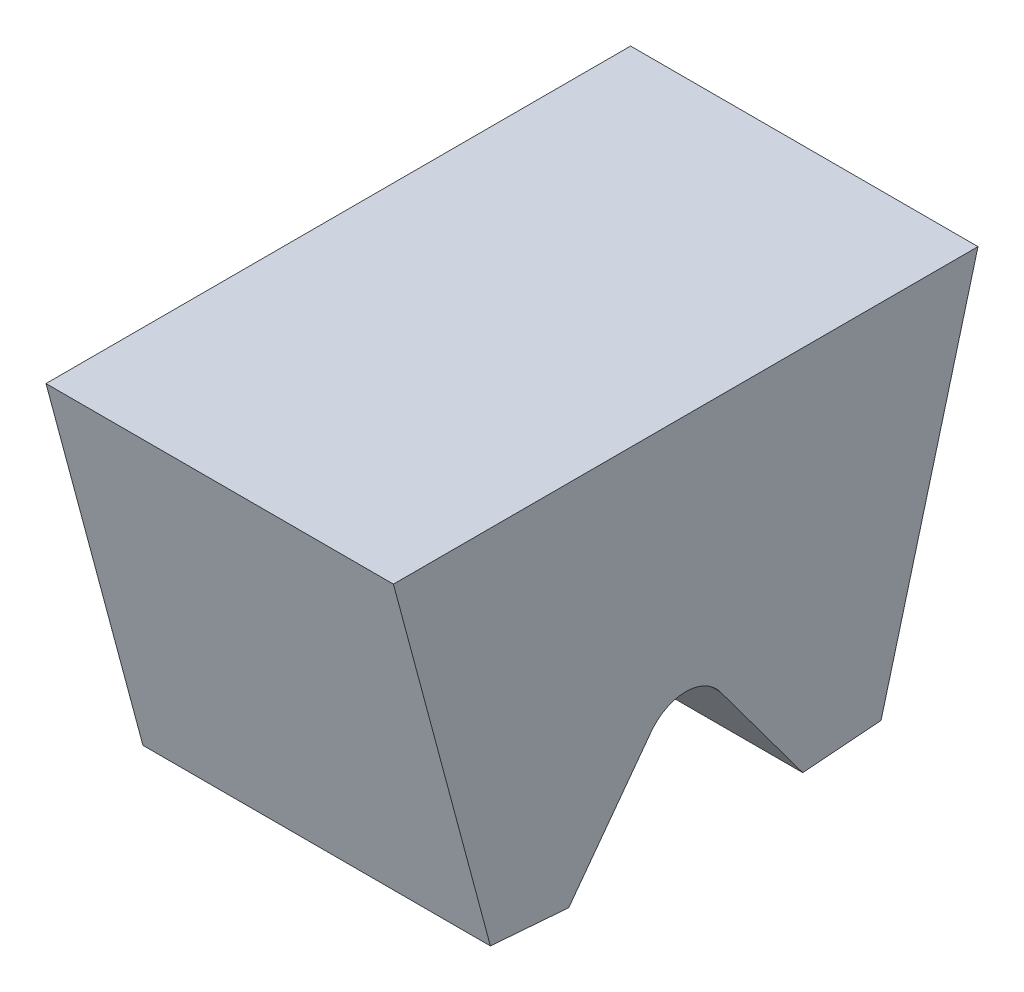
ISO-10303-21;
HEADER;
FILE_DESCRIPTION(('STEP AP214'),'2;1');
FILE_NAME('part.step','',(''),(''),'','','');
FILE_SCHEMA(('AUTOMOTIVE_DESIGN { 1 0 10303 214 1 1 1 1 }'));
ENDSEC;
DATA;
#1=APPLICATION_CONTEXT('core data for automotive mechanical design processes');
#2=APPLICATION_PROTOCOL_DEFINITION('international standard','automotive_design',2000,#1);
#3=PRODUCT_CONTEXT('',#1,'mechanical');
#4=PRODUCT('Part','Part','',(#3));
#5=PRODUCT_RELATED_PRODUCT_CATEGORY('part','',(#4));
#6=PRODUCT_DEFINITION_FORMATION('','',#4);
#7=PRODUCT_DEFINITION_CONTEXT('part definition',#1,'design');
#8=PRODUCT_DEFINITION('design','',#6,#7);
#9=PRODUCT_DEFINITION_SHAPE('','',#8);
#10=(LENGTH_UNIT() NAMED_UNIT(*) SI_UNIT(.MILLI.,.METRE.));
#11=(NAMED_UNIT(*) PLANE_ANGLE_UNIT() SI_UNIT($,.RADIAN.));
#12=(NAMED_UNIT(*) SI_UNIT($,.STERADIAN.) SOLID_ANGLE_UNIT());
#13=UNCERTAINTY_MEASURE_WITH_UNIT(LENGTH_MEASURE(1.E-05),#10,'distance_accuracy_value','');
#14=(GEOMETRIC_REPRESENTATION_CONTEXT(3) GLOBAL_UNCERTAINTY_ASSIGNED_CONTEXT((#13)) GLOBAL_UNIT_ASSIGNED_CONTEXT((#10,
#11,#12)) REPRESENTATION_CONTEXT('',''));
#15=CARTESIAN_POINT('',(0.,0.,0.));
#16=DIRECTION('',(0.,0.,1.));
#17=DIRECTION('',(1.,0.,0.));
#18=AXIS2_PLACEMENT_3D('',#15,#16,#17);
#19=CARTESIAN_POINT('',(0.,0.277595628415304,0.));
#20=DIRECTION('',(0.,1.,0.));
#21=DIRECTION('',(0.,0.,1.));
#22=AXIS2_PLACEMENT_3D('',#19,#20,#21);
#23=PLANE('',#22);
#24=DIRECTION('',(0.,0.,1.));
#25=VECTOR('',#24,1.);
#26=CARTESIAN_POINT('',(0.0912799800000001,0.277595628415304,1.50859998));
#27=LINE('',#26,#25);
#28=CARTESIAN_POINT('',(0.0912799800000005,0.277595628415304,-0.224241524456291));
#29=VERTEX_POINT('',#28);
#30=CARTESIAN_POINT('',(0.0912799800000005,0.277595628415304,0.224241524456291));
#31=VERTEX_POINT('',#30);
#32=EDGE_CURVE('E220',#29,#31,#27,.T.);
#33=ORIENTED_EDGE('',*,*,#32,.F.);
#34=DIRECTION('',(1.,0.,0.));
#35=VECTOR('',#34,1.);
#36=CARTESIAN_POINT('',(1.50859998,0.277595628415304,-0.224241524456291));
#37=LINE('',#36,#35);
#38=CARTESIAN_POINT('',(-0.17526,0.277595628415304,-0.224241524456291));
#39=VERTEX_POINT('',#38);
#40=EDGE_CURVE('E58',#39,#29,#37,.T.);
#41=ORIENTED_EDGE('',*,*,#40,.F.);
#42=DIRECTION('',(0.,0.,-1.));
#43=VECTOR('',#42,1.);
#44=CARTESIAN_POINT('',(-0.17526,0.277595628415304,1.50859998));
#45=LINE('',#44,#43);
#46=CARTESIAN_POINT('',(-0.17526,0.277595628415304,0.224241524456291));
#47=VERTEX_POINT('',#46);
#48=EDGE_CURVE('E12',#47,#39,#45,.T.);
#49=ORIENTED_EDGE('',*,*,#48,.F.);
#50=DIRECTION('',(-1.,0.,0.));
#51=VECTOR('',#50,1.);
#52=CARTESIAN_POINT('',(1.50859998,0.277595628415304,0.224241524456291));
#53=LINE('',#52,#51);
#54=EDGE_CURVE('E106',#31,#47,#53,.T.);
#55=ORIENTED_EDGE('',*,*,#54,.F.);
#56=EDGE_LOOP('',(#33,#41,#49,#55));
#57=FACE_BOUND('',#56,.T.);
#58=ADVANCED_FACE('F42',(#57),#23,.T.);
#59=CARTESIAN_POINT('',(1.50859998,0.,-0.14986));
#60=DIRECTION('',(0.,-0.258819045102522,-0.965925826289068));
#61=DIRECTION('',(0.,0.965925826289068,-0.258819045102522));
#62=AXIS2_PLACEMENT_3D('',#59,#60,#61);
#63=PLANE('',#62);
#64=DIRECTION('',(0.,0.965925826289068,-0.258819045102522));
#65=VECTOR('',#64,1.);
#66=CARTESIAN_POINT('',(-0.17526,0.,-0.14986));
#67=LINE('',#66,#65);
#68=CARTESIAN_POINT('',(-0.17526,0.,-0.14986));
#69=VERTEX_POINT('',#68);
#70=EDGE_CURVE('E143',#69,#39,#67,.T.);
#71=ORIENTED_EDGE('',*,*,#70,.T.);
#72=ORIENTED_EDGE('',*,*,#40,.T.);
#73=DIRECTION('',(0.,-0.965925826289068,0.258819045102522));
#74=VECTOR('',#73,1.);
#75=CARTESIAN_POINT('',(0.0912799800000001,0.,-0.14986));
#76=LINE('',#75,#74);
#77=CARTESIAN_POINT('',(0.0912799800000001,0.,-0.14986));
#78=VERTEX_POINT('',#77);
#79=EDGE_CURVE('E137',#29,#78,#76,.T.);
#80=ORIENTED_EDGE('',*,*,#79,.T.);
#81=DIRECTION('',(-1.,0.,0.));
#82=VECTOR('',#81,1.);
#83=CARTESIAN_POINT('',(1.50859998,0.,-0.14986));
#84=LINE('',#83,#82);
#85=EDGE_CURVE('E129',#78,#69,#84,.T.);
#86=ORIENTED_EDGE('',*,*,#85,.T.);
#87=EDGE_LOOP('',(#71,#72,#80,#86));
#88=FACE_BOUND('',#87,.T.);
#89=ADVANCED_FACE('F151',(#88),#63,.T.);
#90=CARTESIAN_POINT('',(1.50859998,0.,0.14986));
#91=DIRECTION('',(0.,-0.258819045102522,0.965925826289068));
#92=DIRECTION('',(0.,-0.965925826289068,-0.258819045102522));
#93=AXIS2_PLACEMENT_3D('',#90,#91,#92);
#94=PLANE('',#93);
#95=DIRECTION('',(0.,0.965925826289068,0.258819045102522));
#96=VECTOR('',#95,1.);
#97=CARTESIAN_POINT('',(0.0912799800000001,0.,0.14986));
#98=LINE('',#97,#96);
#99=CARTESIAN_POINT('',(0.0912799800000001,0.,0.14986));
#100=VERTEX_POINT('',#99);
#101=EDGE_CURVE('E119',#100,#31,#98,.T.);
#102=ORIENTED_EDGE('',*,*,#101,.T.);
#103=ORIENTED_EDGE('',*,*,#54,.T.);
#104=DIRECTION('',(0.,-0.965925826289068,-0.258819045102522));
#105=VECTOR('',#104,1.);
#106=CARTESIAN_POINT('',(-0.17526,0.,0.14986));
#107=LINE('',#106,#105);
#108=CARTESIAN_POINT('',(-0.17526,0.,0.14986));
#109=VERTEX_POINT('',#108);
#110=EDGE_CURVE('E116',#47,#109,#107,.T.);
#111=ORIENTED_EDGE('',*,*,#110,.T.);
#112=DIRECTION('',(-1.,0.,0.));
#113=VECTOR('',#112,1.);
#114=CARTESIAN_POINT('',(1.50859998,0.,0.14986));
#115=LINE('',#114,#113);
#116=EDGE_CURVE('E147',#100,#109,#115,.T.);
#117=ORIENTED_EDGE('',*,*,#116,.F.);
#118=EDGE_LOOP('',(#102,#103,#111,#117));
#119=FACE_BOUND('',#118,.T.);
#120=ADVANCED_FACE('F114',(#119),#94,.T.);
#121=CARTESIAN_POINT('',(0.09127998,0.49800002,1.50859998));
#122=DIRECTION('',(1.,0.,0.));
#123=DIRECTION('',(0.,1.,0.));
#124=AXIS2_PLACEMENT_3D('',#121,#122,#123);
#125=PLANE('',#124);
#126=ORIENTED_EDGE('',*,*,#79,.F.);
#127=ORIENTED_EDGE('',*,*,#32,.T.);
#128=ORIENTED_EDGE('',*,*,#101,.F.);
#129=DIRECTION('',(0.,0.,1.));
#130=VECTOR('',#129,1.);
#131=CARTESIAN_POINT('',(0.0912799800000001,0.,0.14986));
#132=LINE('',#131,#130);
#133=CARTESIAN_POINT('',(0.09127998,-0.00464924517620328,0.0897510956585027));
#134=VERTEX_POINT('',#133);
#135=EDGE_CURVE('E138',#134,#100,#132,.T.);
#136=ORIENTED_EDGE('',*,*,#135,.F.);
#137=DIRECTION('',(0.,-0.819152044288994,0.573576436351043));
#138=VECTOR('',#137,1.);
#139=CARTESIAN_POINT('',(0.0912799800000001,-0.335652385393843,0.318020958921004));
#140=LINE('',#139,#138);
#141=CARTESIAN_POINT('',(0.0912799800000001,0.0798994939283115,0.0270484005024227));
#142=VERTEX_POINT('',#141);
#143=EDGE_CURVE('E65',#142,#134,#140,.T.);
#144=ORIENTED_EDGE('',*,*,#143,.F.);
#145=CARTESIAN_POINT('',(0.0912799800000001,0.0609599999999999,0.));
#146=DIRECTION('',(1.,0.,0.));
#147=DIRECTION('',(0.,1.,0.));
#148=AXIS2_PLACEMENT_3D('',#145,#146,#147);
#149=CIRCLE('',#148,0.0330200000000002);
#150=CARTESIAN_POINT('',(0.0912799800000001,0.0798994939283115,-0.0270484005024227));
#151=VERTEX_POINT('',#150);
#152=EDGE_CURVE('E159',#151,#142,#149,.T.);
#153=ORIENTED_EDGE('',*,*,#152,.F.);
#154=DIRECTION('',(0.,0.819152044288994,0.573576436351043));
#155=VECTOR('',#154,1.);
#156=CARTESIAN_POINT('',(0.0912799799999999,1.08196788352992,0.674607439698283));
#157=LINE('',#156,#155);
#158=CARTESIAN_POINT('',(0.09127998,-0.00464924517620327,-0.0897510956585027));
#159=VERTEX_POINT('',#158);
#160=EDGE_CURVE('E200',#159,#151,#157,.T.);
#161=ORIENTED_EDGE('',*,*,#160,.F.);
#162=EDGE_CURVE('E133',#78,#159,#132,.T.);
#163=ORIENTED_EDGE('',*,*,#162,.F.);
#164=EDGE_LOOP('',(#126,#127,#128,#136,#144,#153,#161,#163));
#165=FACE_BOUND('',#164,.T.);
#166=ADVANCED_FACE('F223',(#165),#125,.T.);
#167=CARTESIAN_POINT('',(-0.17526,-0.00999998,1.50859998));
#168=DIRECTION('',(-1.,0.,0.));
#169=DIRECTION('',(0.,-1.,0.));
#170=AXIS2_PLACEMENT_3D('',#167,#168,#169);
#171=PLANE('',#170);
#172=ORIENTED_EDGE('',*,*,#110,.F.);
#173=ORIENTED_EDGE('',*,*,#48,.T.);
#174=ORIENTED_EDGE('',*,*,#70,.F.);
#175=DIRECTION('',(0.,0.,-1.));
#176=VECTOR('',#175,1.);
#177=CARTESIAN_POINT('',(-0.17526,0.,0.14986));
#178=LINE('',#177,#176);
#179=CARTESIAN_POINT('',(-0.17526,-0.00464924517620327,-0.0897510956585027));
#180=VERTEX_POINT('',#179);
#181=EDGE_CURVE('E157',#180,#69,#178,.T.);
#182=ORIENTED_EDGE('',*,*,#181,.F.);
#183=DIRECTION('',(0.,-0.819152044288994,-0.573576436351043));
#184=VECTOR('',#183,1.);
#185=CARTESIAN_POINT('',(-0.17526,0.7410947671252,0.435925514018663));
#186=LINE('',#185,#184);
#187=CARTESIAN_POINT('',(-0.17526,0.0798994939283115,-0.0270484005024227));
#188=VERTEX_POINT('',#187);
#189=EDGE_CURVE('E204',#188,#180,#186,.T.);
#190=ORIENTED_EDGE('',*,*,#189,.F.);
#191=CARTESIAN_POINT('',(-0.17526,0.0609599999999999,0.));
#192=DIRECTION('',(-1.,0.,0.));
#193=DIRECTION('',(0.,-1.,0.));
#194=AXIS2_PLACEMENT_3D('',#191,#192,#193);
#195=CIRCLE('',#194,0.0330200000000002);
#196=CARTESIAN_POINT('',(-0.17526,0.0798994939283115,0.0270484005024227));
#197=VERTEX_POINT('',#196);
#198=EDGE_CURVE('E51',#197,#188,#195,.T.);
#199=ORIENTED_EDGE('',*,*,#198,.F.);
#200=DIRECTION('',(0.,0.819152044288994,-0.573576436351043));
#201=VECTOR('',#200,1.);
#202=CARTESIAN_POINT('',(-0.17526,-0.676525501798564,0.556702884600624));
#203=LINE('',#202,#201);
#204=CARTESIAN_POINT('',(-0.17526,-0.00464924517620328,0.0897510956585027));
#205=VERTEX_POINT('',#204);
#206=EDGE_CURVE('E211',#205,#197,#203,.T.);
#207=ORIENTED_EDGE('',*,*,#206,.F.);
#208=EDGE_CURVE('E124',#109,#205,#178,.T.);
#209=ORIENTED_EDGE('',*,*,#208,.F.);
#210=EDGE_LOOP('',(#172,#173,#174,#182,#190,#199,#207,#209));
#211=FACE_BOUND('',#210,.T.);
#212=ADVANCED_FACE('F121',(#211),#171,.T.);
#213=CARTESIAN_POINT('',(0.,0.,0.));
#214=DIRECTION('',(0.,1.,0.));
#215=DIRECTION('',(0.,0.,1.));
#216=AXIS2_PLACEMENT_3D('',#213,#214,#215);
#217=PLANE('',#216);
#218=ORIENTED_EDGE('',*,*,#162,.T.);
#219=CARTESIAN_POINT('',(0.0912799800000001,0.,-0.0829946284501669));
#220=DIRECTION('',(-1.,0.,0.));
#221=VECTOR('',#220,1.);
#222=LINE('',#219,#221);
#223=EDGE_CURVE('E128',#159,#180,#222,.T.);
#224=ORIENTED_EDGE('',*,*,#223,.T.);
#225=ORIENTED_EDGE('',*,*,#181,.T.);
#226=ORIENTED_EDGE('',*,*,#85,.F.);
#227=EDGE_LOOP('',(#218,#224,#225,#226));
#228=FACE_BOUND('',#227,.T.);
#229=ADVANCED_FACE('F227',(#228),#217,.F.);
#230=ORIENTED_EDGE('',*,*,#208,.T.);
#231=CARTESIAN_POINT('',(-0.17526,0.,0.0829946284501669));
#232=DIRECTION('',(1.,0.,0.));
#233=VECTOR('',#232,1.);
#234=LINE('',#231,#233);
#235=EDGE_CURVE('E126',#205,#134,#234,.T.);
#236=ORIENTED_EDGE('',*,*,#235,.T.);
#237=ORIENTED_EDGE('',*,*,#135,.T.);
#238=ORIENTED_EDGE('',*,*,#116,.T.);
#239=EDGE_LOOP('',(#230,#236,#237,#238));
#240=FACE_BOUND('',#239,.T.);
#241=ADVANCED_FACE('F44',(#240),#217,.F.);
#242=CARTESIAN_POINT('',(-1.20142,0.0798994939283115,-0.0270484005024227));
#243=DIRECTION('',(0.,0.573576436351043,-0.819152044288994));
#244=DIRECTION('',(0.,0.819152044288994,0.573576436351043));
#245=AXIS2_PLACEMENT_3D('',#242,#243,#244);
#246=PLANE('',#245);
#247=ORIENTED_EDGE('',*,*,#160,.T.);
#248=DIRECTION('',(1.,0.,0.));
#249=VECTOR('',#248,1.);
#250=CARTESIAN_POINT('',(-1.20142,0.0798994939283115,-0.0270484005024227));
#251=LINE('',#250,#249);
#252=EDGE_CURVE('E217',#188,#151,#251,.T.);
#253=ORIENTED_EDGE('',*,*,#252,.F.);
#254=ORIENTED_EDGE('',*,*,#189,.T.);
#255=ORIENTED_EDGE('',*,*,#223,.F.);
#256=EDGE_LOOP('',(#247,#253,#254,#255));
#257=FACE_BOUND('',#256,.T.);
#258=ADVANCED_FACE('F170',(#257),#246,.F.);
#259=CARTESIAN_POINT('',(-1.20142,-0.00999998000000012,0.0899966898281132));
#260=DIRECTION('',(0.,0.573576436351043,0.819152044288994));
#261=DIRECTION('',(0.,-0.819152044288994,0.573576436351043));
#262=AXIS2_PLACEMENT_3D('',#259,#260,#261);
#263=PLANE('',#262);
#264=ORIENTED_EDGE('',*,*,#143,.T.);
#265=ORIENTED_EDGE('',*,*,#235,.F.);
#266=ORIENTED_EDGE('',*,*,#206,.T.);
#267=DIRECTION('',(1.,0.,0.));
#268=VECTOR('',#267,1.);
#269=CARTESIAN_POINT('',(-1.20142,0.0798994939283115,0.0270484005024227));
#270=LINE('',#269,#268);
#271=EDGE_CURVE('E215',#197,#142,#270,.T.);
#272=ORIENTED_EDGE('',*,*,#271,.T.);
#273=EDGE_LOOP('',(#264,#265,#266,#272));
#274=FACE_BOUND('',#273,.T.);
#275=ADVANCED_FACE('F180',(#274),#263,.F.);
#276=CARTESIAN_POINT('',(-1.20142,0.0609599999999999,0.));
#277=DIRECTION('',(1.,0.,0.));
#278=DIRECTION('',(0.,0.,-1.));
#279=AXIS2_PLACEMENT_3D('',#276,#277,#278);
#280=CYLINDRICAL_SURFACE('',#279,0.0330200000000002);
#281=ORIENTED_EDGE('',*,*,#152,.T.);
#282=ORIENTED_EDGE('',*,*,#271,.F.);
#283=ORIENTED_EDGE('',*,*,#198,.T.);
#284=ORIENTED_EDGE('',*,*,#252,.T.);
#285=EDGE_LOOP('',(#281,#282,#283,#284));
#286=FACE_BOUND('',#285,.T.);
#287=ADVANCED_FACE('F182',(#286),#280,.F.);
#288=CLOSED_SHELL('',(#58,#89,#120,#166,#212,#229,#241,#258,#275,#287));
#289=MANIFOLD_SOLID_BREP('B2',#288);
#290=ADVANCED_BREP_SHAPE_REPRESENTATION('',(#18,#289),#14);
#291=SHAPE_DEFINITION_REPRESENTATION(#9,#290);
ENDSEC;
END-ISO-10303-21;
